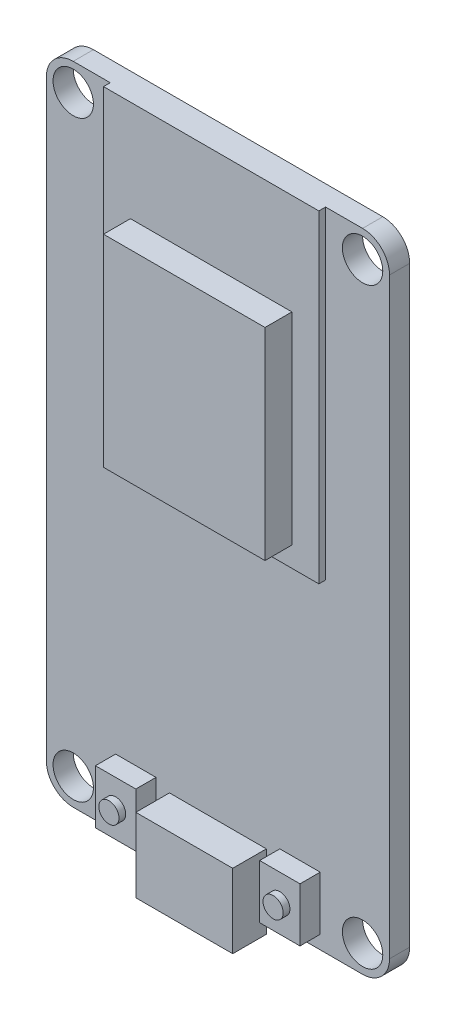
ISO-10303-21;
HEADER;
FILE_DESCRIPTION(('STEP AP214'),'2;1');
FILE_NAME('part.step','',(''),(''),'','','');
FILE_SCHEMA(('AUTOMOTIVE_DESIGN { 1 0 10303 214 1 1 1 1 }'));
ENDSEC;
DATA;
#1=APPLICATION_CONTEXT('core data for automotive mechanical design processes');
#2=APPLICATION_PROTOCOL_DEFINITION('international standard','automotive_design',2000,#1);
#3=PRODUCT_CONTEXT('',#1,'mechanical');
#4=PRODUCT('Part','Part','',(#3));
#5=PRODUCT_RELATED_PRODUCT_CATEGORY('part','',(#4));
#6=PRODUCT_DEFINITION_FORMATION('','',#4);
#7=PRODUCT_DEFINITION_CONTEXT('part definition',#1,'design');
#8=PRODUCT_DEFINITION('design','',#6,#7);
#9=PRODUCT_DEFINITION_SHAPE('','',#8);
#10=(LENGTH_UNIT() NAMED_UNIT(*) SI_UNIT(.MILLI.,.METRE.));
#11=(NAMED_UNIT(*) PLANE_ANGLE_UNIT() SI_UNIT($,.RADIAN.));
#12=(NAMED_UNIT(*) SI_UNIT($,.STERADIAN.) SOLID_ANGLE_UNIT());
#13=UNCERTAINTY_MEASURE_WITH_UNIT(LENGTH_MEASURE(1.E-05),#10,'distance_accuracy_value','');
#14=(GEOMETRIC_REPRESENTATION_CONTEXT(3) GLOBAL_UNCERTAINTY_ASSIGNED_CONTEXT((#13)) GLOBAL_UNIT_ASSIGNED_CONTEXT((#10,
#11,#12)) REPRESENTATION_CONTEXT('',''));
#15=CARTESIAN_POINT('',(0.,0.,0.));
#16=DIRECTION('',(0.,0.,1.));
#17=DIRECTION('',(1.,0.,0.));
#18=AXIS2_PLACEMENT_3D('',#15,#16,#17);
#19=CARTESIAN_POINT('',(0.,0.,1.5));
#20=DIRECTION('',(0.,0.,1.));
#21=DIRECTION('',(1.,0.,0.));
#22=AXIS2_PLACEMENT_3D('',#19,#20,#21);
#23=PLANE('',#22);
#24=CARTESIAN_POINT('',(-10.75,-22.,1.5));
#25=DIRECTION('',(0.,0.,1.));
#26=DIRECTION('',(1.,0.,0.));
#27=AXIS2_PLACEMENT_3D('',#24,#25,#26);
#28=CIRCLE('',#27,1.5);
#29=CARTESIAN_POINT('',(-9.25,-22.,1.5));
#30=VERTEX_POINT('',#29);
#31=EDGE_CURVE('E399',#30,#30,#28,.T.);
#32=ORIENTED_EDGE('',*,*,#31,.F.);
#33=EDGE_LOOP('',(#32));
#34=FACE_BOUND('',#33,.T.);
#35=CARTESIAN_POINT('',(10.75,-22.,1.5));
#36=DIRECTION('',(0.,0.,1.));
#37=DIRECTION('',(1.,0.,0.));
#38=AXIS2_PLACEMENT_3D('',#35,#36,#37);
#39=CIRCLE('',#38,1.5);
#40=CARTESIAN_POINT('',(12.25,-22.,1.5));
#41=VERTEX_POINT('',#40);
#42=EDGE_CURVE('E396',#41,#41,#39,.T.);
#43=ORIENTED_EDGE('',*,*,#42,.F.);
#44=EDGE_LOOP('',(#43));
#45=FACE_BOUND('',#44,.T.);
#46=CARTESIAN_POINT('',(10.75,22.,1.5));
#47=DIRECTION('',(0.,0.,1.));
#48=DIRECTION('',(1.,0.,0.));
#49=AXIS2_PLACEMENT_3D('',#46,#47,#48);
#50=CIRCLE('',#49,1.5);
#51=CARTESIAN_POINT('',(12.25,22.,1.5));
#52=VERTEX_POINT('',#51);
#53=EDGE_CURVE('E393',#52,#52,#50,.T.);
#54=ORIENTED_EDGE('',*,*,#53,.F.);
#55=EDGE_LOOP('',(#54));
#56=FACE_BOUND('',#55,.T.);
#57=CARTESIAN_POINT('',(-10.75,22.,1.5));
#58=DIRECTION('',(0.,0.,1.));
#59=DIRECTION('',(1.,0.,0.));
#60=AXIS2_PLACEMENT_3D('',#57,#58,#59);
#61=CIRCLE('',#60,1.5);
#62=CARTESIAN_POINT('',(-9.25000000000001,22.,1.5));
#63=VERTEX_POINT('',#62);
#64=EDGE_CURVE('E390',#63,#63,#61,.T.);
#65=ORIENTED_EDGE('',*,*,#64,.F.);
#66=EDGE_LOOP('',(#65));
#67=FACE_BOUND('',#66,.T.);
#68=DIRECTION('',(-1.,0.,0.));
#69=VECTOR('',#68,1.);
#70=CARTESIAN_POINT('',(-3.6,-19.5,1.5));
#71=LINE('',#70,#69);
#72=CARTESIAN_POINT('',(3.6,-19.5,1.5));
#73=VERTEX_POINT('',#72);
#74=CARTESIAN_POINT('',(-3.6,-19.5,1.5));
#75=VERTEX_POINT('',#74);
#76=EDGE_CURVE('E297',#73,#75,#71,.T.);
#77=ORIENTED_EDGE('',*,*,#76,.F.);
#78=DIRECTION('',(0.,-1.,0.));
#79=VECTOR('',#78,1.);
#80=CARTESIAN_POINT('',(3.6,0.,1.5));
#81=LINE('',#80,#79);
#82=CARTESIAN_POINT('',(3.6,-24.,1.5));
#83=VERTEX_POINT('',#82);
#84=EDGE_CURVE('E37',#73,#83,#81,.T.);
#85=ORIENTED_EDGE('',*,*,#84,.T.);
#86=DIRECTION('',(1.,0.,0.));
#87=VECTOR('',#86,1.);
#88=CARTESIAN_POINT('',(-12.75,-24.,1.5));
#89=LINE('',#88,#87);
#90=CARTESIAN_POINT('',(10.75,-24.,1.5));
#91=VERTEX_POINT('',#90);
#92=EDGE_CURVE('E413',#83,#91,#89,.T.);
#93=ORIENTED_EDGE('',*,*,#92,.T.);
#94=CARTESIAN_POINT('',(10.75,-22.,1.5));
#95=DIRECTION('',(0.,0.,1.));
#96=DIRECTION('',(1.,0.,0.));
#97=AXIS2_PLACEMENT_3D('',#94,#95,#96);
#98=CIRCLE('',#97,2.);
#99=CARTESIAN_POINT('',(12.75,-22.,1.5));
#100=VERTEX_POINT('',#99);
#101=EDGE_CURVE('E451',#91,#100,#98,.T.);
#102=ORIENTED_EDGE('',*,*,#101,.T.);
#103=DIRECTION('',(0.,1.,0.));
#104=VECTOR('',#103,1.);
#105=CARTESIAN_POINT('',(12.75,24.,1.5));
#106=LINE('',#105,#104);
#107=CARTESIAN_POINT('',(12.75,22.,1.5));
#108=VERTEX_POINT('',#107);
#109=EDGE_CURVE('E403',#100,#108,#106,.T.);
#110=ORIENTED_EDGE('',*,*,#109,.T.);
#111=CARTESIAN_POINT('',(10.75,22.,1.5));
#112=DIRECTION('',(0.,0.,1.));
#113=DIRECTION('',(1.,0.,0.));
#114=AXIS2_PLACEMENT_3D('',#111,#112,#113);
#115=CIRCLE('',#114,2.);
#116=CARTESIAN_POINT('',(10.75,24.,1.5));
#117=VERTEX_POINT('',#116);
#118=EDGE_CURVE('E447',#108,#117,#115,.T.);
#119=ORIENTED_EDGE('',*,*,#118,.T.);
#120=DIRECTION('',(-1.,0.,0.));
#121=VECTOR('',#120,1.);
#122=CARTESIAN_POINT('',(-12.75,24.,1.5));
#123=LINE('',#122,#121);
#124=CARTESIAN_POINT('',(7.99999999999999,24.,1.5));
#125=VERTEX_POINT('',#124);
#126=EDGE_CURVE('E408',#117,#125,#123,.T.);
#127=ORIENTED_EDGE('',*,*,#126,.T.);
#128=DIRECTION('',(0.,1.,0.));
#129=VECTOR('',#128,1.);
#130=CARTESIAN_POINT('',(7.99999999999999,24.,1.5));
#131=LINE('',#130,#129);
#132=CARTESIAN_POINT('',(8.,0.,1.5));
#133=VERTEX_POINT('',#132);
#134=EDGE_CURVE('E348',#133,#125,#131,.T.);
#135=ORIENTED_EDGE('',*,*,#134,.F.);
#136=DIRECTION('',(1.,0.,0.));
#137=VECTOR('',#136,1.);
#138=CARTESIAN_POINT('',(-8.,0.,1.5));
#139=LINE('',#138,#137);
#140=CARTESIAN_POINT('',(-8.,0.,1.5));
#141=VERTEX_POINT('',#140);
#142=EDGE_CURVE('E353',#141,#133,#139,.T.);
#143=ORIENTED_EDGE('',*,*,#142,.F.);
#144=DIRECTION('',(0.,-1.,0.));
#145=VECTOR('',#144,1.);
#146=CARTESIAN_POINT('',(-8.00000000000001,24.,1.5));
#147=LINE('',#146,#145);
#148=CARTESIAN_POINT('',(-8.00000000000001,24.,1.5));
#149=VERTEX_POINT('',#148);
#150=EDGE_CURVE('E362',#149,#141,#147,.T.);
#151=ORIENTED_EDGE('',*,*,#150,.F.);
#152=CARTESIAN_POINT('',(-10.75,24.,1.5));
#153=VERTEX_POINT('',#152);
#154=EDGE_CURVE('E406',#149,#153,#123,.T.);
#155=ORIENTED_EDGE('',*,*,#154,.T.);
#156=CARTESIAN_POINT('',(-10.75,22.,1.5));
#157=DIRECTION('',(0.,0.,1.));
#158=DIRECTION('',(1.,0.,0.));
#159=AXIS2_PLACEMENT_3D('',#156,#157,#158);
#160=CIRCLE('',#159,2.);
#161=CARTESIAN_POINT('',(-12.75,22.,1.5));
#162=VERTEX_POINT('',#161);
#163=EDGE_CURVE('E449',#153,#162,#160,.T.);
#164=ORIENTED_EDGE('',*,*,#163,.T.);
#165=DIRECTION('',(0.,-1.,0.));
#166=VECTOR('',#165,1.);
#167=CARTESIAN_POINT('',(-12.75,24.,1.5));
#168=LINE('',#167,#166);
#169=CARTESIAN_POINT('',(-12.75,-22.,1.5));
#170=VERTEX_POINT('',#169);
#171=EDGE_CURVE('E410',#162,#170,#168,.T.);
#172=ORIENTED_EDGE('',*,*,#171,.T.);
#173=CARTESIAN_POINT('',(-10.75,-22.,1.5));
#174=DIRECTION('',(0.,0.,1.));
#175=DIRECTION('',(1.,0.,0.));
#176=AXIS2_PLACEMENT_3D('',#173,#174,#175);
#177=CIRCLE('',#176,2.);
#178=CARTESIAN_POINT('',(-10.75,-24.,1.5));
#179=VERTEX_POINT('',#178);
#180=EDGE_CURVE('E453',#170,#179,#177,.T.);
#181=ORIENTED_EDGE('',*,*,#180,.T.);
#182=CARTESIAN_POINT('',(-3.6,-24.,1.5));
#183=VERTEX_POINT('',#182);
#184=EDGE_CURVE('E414',#179,#183,#89,.T.);
#185=ORIENTED_EDGE('',*,*,#184,.T.);
#186=DIRECTION('',(0.,-1.,0.));
#187=VECTOR('',#186,1.);
#188=CARTESIAN_POINT('',(-3.6,-19.5,1.5));
#189=LINE('',#188,#187);
#190=EDGE_CURVE('E301',#75,#183,#189,.T.);
#191=ORIENTED_EDGE('',*,*,#190,.F.);
#192=EDGE_LOOP('',(#77,#85,#93,#102,#110,#119,#127,#135,#143,#151,#155,#164,#172,#181,#185,#191));
#193=FACE_BOUND('',#192,.T.);
#194=DIRECTION('',(1.,0.,0.));
#195=VECTOR('',#194,1.);
#196=CARTESIAN_POINT('',(-7.6,-23.,1.5));
#197=LINE('',#196,#195);
#198=CARTESIAN_POINT('',(-7.6,-23.,1.5));
#199=VERTEX_POINT('',#198);
#200=CARTESIAN_POINT('',(-4.59999999999999,-23.,1.5));
#201=VERTEX_POINT('',#200);
#202=EDGE_CURVE('E255',#199,#201,#197,.T.);
#203=ORIENTED_EDGE('',*,*,#202,.F.);
#204=DIRECTION('',(0.,-1.,0.));
#205=VECTOR('',#204,1.);
#206=CARTESIAN_POINT('',(-7.6,-19.,1.5));
#207=LINE('',#206,#205);
#208=CARTESIAN_POINT('',(-7.6,-19.,1.5));
#209=VERTEX_POINT('',#208);
#210=EDGE_CURVE('E252',#209,#199,#207,.T.);
#211=ORIENTED_EDGE('',*,*,#210,.F.);
#212=DIRECTION('',(-1.,0.,0.));
#213=VECTOR('',#212,1.);
#214=CARTESIAN_POINT('',(-7.6,-19.,1.5));
#215=LINE('',#214,#213);
#216=CARTESIAN_POINT('',(-4.6,-19.,1.5));
#217=VERTEX_POINT('',#216);
#218=EDGE_CURVE('E264',#217,#209,#215,.T.);
#219=ORIENTED_EDGE('',*,*,#218,.F.);
#220=DIRECTION('',(0.,1.,0.));
#221=VECTOR('',#220,1.);
#222=CARTESIAN_POINT('',(-4.6,-19.,1.5));
#223=LINE('',#222,#221);
#224=EDGE_CURVE('E272',#201,#217,#223,.T.);
#225=ORIENTED_EDGE('',*,*,#224,.F.);
#226=EDGE_LOOP('',(#203,#211,#219,#225));
#227=FACE_BOUND('',#226,.T.);
#228=DIRECTION('',(-1.,0.,0.));
#229=VECTOR('',#228,1.);
#230=CARTESIAN_POINT('',(7.6,-19.,1.5));
#231=LINE('',#230,#229);
#232=CARTESIAN_POINT('',(7.6,-19.,1.5));
#233=VERTEX_POINT('',#232);
#234=CARTESIAN_POINT('',(4.6,-19.,1.5));
#235=VERTEX_POINT('',#234);
#236=EDGE_CURVE('E483',#233,#235,#231,.T.);
#237=ORIENTED_EDGE('',*,*,#236,.F.);
#238=DIRECTION('',(0.,1.,0.));
#239=VECTOR('',#238,1.);
#240=CARTESIAN_POINT('',(7.6,-19.,1.5));
#241=LINE('',#240,#239);
#242=CARTESIAN_POINT('',(7.6,-23.,1.5));
#243=VERTEX_POINT('',#242);
#244=EDGE_CURVE('E250',#243,#233,#241,.T.);
#245=ORIENTED_EDGE('',*,*,#244,.F.);
#246=DIRECTION('',(1.,0.,0.));
#247=VECTOR('',#246,1.);
#248=CARTESIAN_POINT('',(7.6,-23.,1.5));
#249=LINE('',#248,#247);
#250=CARTESIAN_POINT('',(4.59999999999999,-23.,1.5));
#251=VERTEX_POINT('',#250);
#252=EDGE_CURVE('E246',#251,#243,#249,.T.);
#253=ORIENTED_EDGE('',*,*,#252,.F.);
#254=DIRECTION('',(0.,-1.,0.));
#255=VECTOR('',#254,1.);
#256=CARTESIAN_POINT('',(4.6,-19.,1.5));
#257=LINE('',#256,#255);
#258=EDGE_CURVE('E485',#235,#251,#257,.T.);
#259=ORIENTED_EDGE('',*,*,#258,.F.);
#260=EDGE_LOOP('',(#237,#245,#253,#259));
#261=FACE_BOUND('',#260,.T.);
#262=ADVANCED_FACE('F33',(#34,#45,#56,#67,#193,#227,#261),#23,.T.);
#263=CARTESIAN_POINT('',(12.75,24.,1.5));
#264=DIRECTION('',(-1.,0.,0.));
#265=DIRECTION('',(0.,-1.,0.));
#266=AXIS2_PLACEMENT_3D('',#263,#264,#265);
#267=PLANE('',#266);
#268=ORIENTED_EDGE('',*,*,#109,.F.);
#269=DIRECTION('',(0.,0.,-1.));
#270=VECTOR('',#269,1.);
#271=CARTESIAN_POINT('',(12.75,-22.,1.5));
#272=LINE('',#271,#270);
#273=CARTESIAN_POINT('',(12.75,-22.,0.));
#274=VERTEX_POINT('',#273);
#275=EDGE_CURVE('E457',#100,#274,#272,.T.);
#276=ORIENTED_EDGE('',*,*,#275,.T.);
#277=DIRECTION('',(0.,1.,0.));
#278=VECTOR('',#277,1.);
#279=CARTESIAN_POINT('',(12.75,24.,0.));
#280=LINE('',#279,#278);
#281=CARTESIAN_POINT('',(12.75,22.,0.));
#282=VERTEX_POINT('',#281);
#283=EDGE_CURVE('E402',#274,#282,#280,.T.);
#284=ORIENTED_EDGE('',*,*,#283,.T.);
#285=DIRECTION('',(0.,0.,-1.));
#286=VECTOR('',#285,1.);
#287=CARTESIAN_POINT('',(12.75,22.,1.5));
#288=LINE('',#287,#286);
#289=EDGE_CURVE('E455',#282,#108,#288,.F.);
#290=ORIENTED_EDGE('',*,*,#289,.T.);
#291=EDGE_LOOP('',(#268,#276,#284,#290));
#292=FACE_BOUND('',#291,.T.);
#293=ADVANCED_FACE('F505',(#292),#267,.F.);
#294=CARTESIAN_POINT('',(-12.75,24.,1.5));
#295=DIRECTION('',(0.,-1.,0.));
#296=DIRECTION('',(0.,0.,-1.));
#297=AXIS2_PLACEMENT_3D('',#294,#295,#296);
#298=PLANE('',#297);
#299=DIRECTION('',(-1.,0.,0.));
#300=VECTOR('',#299,1.);
#301=CARTESIAN_POINT('',(-12.75,24.,0.));
#302=LINE('',#301,#300);
#303=CARTESIAN_POINT('',(10.75,24.,0.));
#304=VERTEX_POINT('',#303);
#305=CARTESIAN_POINT('',(-10.75,24.,0.));
#306=VERTEX_POINT('',#305);
#307=EDGE_CURVE('E421',#304,#306,#302,.T.);
#308=ORIENTED_EDGE('',*,*,#307,.T.);
#309=DIRECTION('',(0.,0.,-1.));
#310=VECTOR('',#309,1.);
#311=CARTESIAN_POINT('',(-10.75,24.,1.5));
#312=LINE('',#311,#310);
#313=EDGE_CURVE('E462',#306,#153,#312,.F.);
#314=ORIENTED_EDGE('',*,*,#313,.T.);
#315=ORIENTED_EDGE('',*,*,#154,.F.);
#316=DIRECTION('',(0.,0.,-1.));
#317=VECTOR('',#316,1.);
#318=CARTESIAN_POINT('',(-8.00000000000001,24.,2.));
#319=LINE('',#318,#317);
#320=CARTESIAN_POINT('',(-8.00000000000001,24.,2.));
#321=VERTEX_POINT('',#320);
#322=EDGE_CURVE('E372',#321,#149,#319,.T.);
#323=ORIENTED_EDGE('',*,*,#322,.F.);
#324=DIRECTION('',(-1.,0.,0.));
#325=VECTOR('',#324,1.);
#326=CARTESIAN_POINT('',(-8.00000000000001,24.,2.));
#327=LINE('',#326,#325);
#328=CARTESIAN_POINT('',(7.99999999999999,24.,2.));
#329=VERTEX_POINT('',#328);
#330=EDGE_CURVE('E352',#329,#321,#327,.T.);
#331=ORIENTED_EDGE('',*,*,#330,.F.);
#332=DIRECTION('',(0.,0.,-1.));
#333=VECTOR('',#332,1.);
#334=CARTESIAN_POINT('',(7.99999999999999,24.,2.));
#335=LINE('',#334,#333);
#336=EDGE_CURVE('E375',#329,#125,#335,.T.);
#337=ORIENTED_EDGE('',*,*,#336,.T.);
#338=ORIENTED_EDGE('',*,*,#126,.F.);
#339=DIRECTION('',(0.,0.,-1.));
#340=VECTOR('',#339,1.);
#341=CARTESIAN_POINT('',(10.75,24.,1.5));
#342=LINE('',#341,#340);
#343=EDGE_CURVE('E460',#117,#304,#342,.T.);
#344=ORIENTED_EDGE('',*,*,#343,.T.);
#345=EDGE_LOOP('',(#308,#314,#315,#323,#331,#337,#338,#344));
#346=FACE_BOUND('',#345,.T.);
#347=ADVANCED_FACE('F513',(#346),#298,.F.);
#348=CARTESIAN_POINT('',(-12.75,24.,1.5));
#349=DIRECTION('',(1.,0.,0.));
#350=DIRECTION('',(0.,1.,0.));
#351=AXIS2_PLACEMENT_3D('',#348,#349,#350);
#352=PLANE('',#351);
#353=DIRECTION('',(0.,-1.,0.));
#354=VECTOR('',#353,1.);
#355=CARTESIAN_POINT('',(-12.75,24.,0.));
#356=LINE('',#355,#354);
#357=CARTESIAN_POINT('',(-12.75,22.,0.));
#358=VERTEX_POINT('',#357);
#359=CARTESIAN_POINT('',(-12.75,-22.,0.));
#360=VERTEX_POINT('',#359);
#361=EDGE_CURVE('E424',#358,#360,#356,.T.);
#362=ORIENTED_EDGE('',*,*,#361,.T.);
#363=DIRECTION('',(0.,0.,-1.));
#364=VECTOR('',#363,1.);
#365=CARTESIAN_POINT('',(-12.75,-22.,1.5));
#366=LINE('',#365,#364);
#367=EDGE_CURVE('E445',#360,#170,#366,.F.);
#368=ORIENTED_EDGE('',*,*,#367,.T.);
#369=ORIENTED_EDGE('',*,*,#171,.F.);
#370=DIRECTION('',(0.,0.,-1.));
#371=VECTOR('',#370,1.);
#372=CARTESIAN_POINT('',(-12.75,22.,1.5));
#373=LINE('',#372,#371);
#374=EDGE_CURVE('E442',#162,#358,#373,.T.);
#375=ORIENTED_EDGE('',*,*,#374,.T.);
#376=EDGE_LOOP('',(#362,#368,#369,#375));
#377=FACE_BOUND('',#376,.T.);
#378=ADVANCED_FACE('F530',(#377),#352,.F.);
#379=CARTESIAN_POINT('',(-12.75,-24.,1.5));
#380=DIRECTION('',(0.,1.,0.));
#381=DIRECTION('',(0.,0.,1.));
#382=AXIS2_PLACEMENT_3D('',#379,#380,#381);
#383=PLANE('',#382);
#384=ORIENTED_EDGE('',*,*,#184,.F.);
#385=DIRECTION('',(0.,0.,-1.));
#386=VECTOR('',#385,1.);
#387=CARTESIAN_POINT('',(-10.75,-24.,1.5));
#388=LINE('',#387,#386);
#389=CARTESIAN_POINT('',(-10.75,-24.,0.));
#390=VERTEX_POINT('',#389);
#391=EDGE_CURVE('E431',#179,#390,#388,.T.);
#392=ORIENTED_EDGE('',*,*,#391,.T.);
#393=DIRECTION('',(1.,0.,0.));
#394=VECTOR('',#393,1.);
#395=CARTESIAN_POINT('',(-12.75,-24.,0.));
#396=LINE('',#395,#394);
#397=CARTESIAN_POINT('',(10.75,-24.,0.));
#398=VERTEX_POINT('',#397);
#399=EDGE_CURVE('E407',#390,#398,#396,.T.);
#400=ORIENTED_EDGE('',*,*,#399,.T.);
#401=DIRECTION('',(0.,0.,-1.));
#402=VECTOR('',#401,1.);
#403=CARTESIAN_POINT('',(10.75,-24.,1.5));
#404=LINE('',#403,#402);
#405=EDGE_CURVE('E417',#398,#91,#404,.F.);
#406=ORIENTED_EDGE('',*,*,#405,.T.);
#407=ORIENTED_EDGE('',*,*,#92,.F.);
#408=EDGE_CURVE('E418',#183,#83,#89,.T.);
#409=ORIENTED_EDGE('',*,*,#408,.F.);
#410=EDGE_LOOP('',(#384,#392,#400,#406,#407,#409));
#411=FACE_BOUND('',#410,.T.);
#412=ADVANCED_FACE('F526',(#411),#383,.F.);
#413=CARTESIAN_POINT('',(0.,0.,0.));
#414=DIRECTION('',(0.,0.,1.));
#415=DIRECTION('',(1.,0.,0.));
#416=AXIS2_PLACEMENT_3D('',#413,#414,#415);
#417=PLANE('',#416);
#418=CARTESIAN_POINT('',(-10.75,-22.,0.));
#419=DIRECTION('',(0.,0.,1.));
#420=DIRECTION('',(1.,0.,0.));
#421=AXIS2_PLACEMENT_3D('',#418,#419,#420);
#422=CIRCLE('',#421,1.5);
#423=CARTESIAN_POINT('',(-9.25,-22.,0.));
#424=VERTEX_POINT('',#423);
#425=EDGE_CURVE('E378',#424,#424,#422,.T.);
#426=ORIENTED_EDGE('',*,*,#425,.T.);
#427=EDGE_LOOP('',(#426));
#428=FACE_BOUND('',#427,.T.);
#429=CARTESIAN_POINT('',(10.75,-22.,0.));
#430=DIRECTION('',(0.,0.,1.));
#431=DIRECTION('',(1.,0.,0.));
#432=AXIS2_PLACEMENT_3D('',#429,#430,#431);
#433=CIRCLE('',#432,1.5);
#434=CARTESIAN_POINT('',(12.25,-22.,0.));
#435=VERTEX_POINT('',#434);
#436=EDGE_CURVE('E383',#435,#435,#433,.T.);
#437=ORIENTED_EDGE('',*,*,#436,.T.);
#438=EDGE_LOOP('',(#437));
#439=FACE_BOUND('',#438,.T.);
#440=CARTESIAN_POINT('',(10.75,22.,0.));
#441=DIRECTION('',(0.,0.,1.));
#442=DIRECTION('',(1.,0.,0.));
#443=AXIS2_PLACEMENT_3D('',#440,#441,#442);
#444=CIRCLE('',#443,1.5);
#445=CARTESIAN_POINT('',(12.25,22.,0.));
#446=VERTEX_POINT('',#445);
#447=EDGE_CURVE('E379',#446,#446,#444,.T.);
#448=ORIENTED_EDGE('',*,*,#447,.T.);
#449=EDGE_LOOP('',(#448));
#450=FACE_BOUND('',#449,.T.);
#451=CARTESIAN_POINT('',(-10.75,22.,0.));
#452=DIRECTION('',(0.,0.,1.));
#453=DIRECTION('',(1.,0.,0.));
#454=AXIS2_PLACEMENT_3D('',#451,#452,#453);
#455=CIRCLE('',#454,1.5);
#456=CARTESIAN_POINT('',(-9.25000000000001,22.,0.));
#457=VERTEX_POINT('',#456);
#458=EDGE_CURVE('E382',#457,#457,#455,.T.);
#459=ORIENTED_EDGE('',*,*,#458,.T.);
#460=EDGE_LOOP('',(#459));
#461=FACE_BOUND('',#460,.T.);
#462=ORIENTED_EDGE('',*,*,#399,.F.);
#463=CARTESIAN_POINT('',(-10.75,-22.,0.));
#464=DIRECTION('',(0.,0.,1.));
#465=DIRECTION('',(1.,0.,0.));
#466=AXIS2_PLACEMENT_3D('',#463,#464,#465);
#467=CIRCLE('',#466,2.);
#468=EDGE_CURVE('E440',#390,#360,#467,.F.);
#469=ORIENTED_EDGE('',*,*,#468,.T.);
#470=ORIENTED_EDGE('',*,*,#361,.F.);
#471=CARTESIAN_POINT('',(-10.75,22.,0.));
#472=DIRECTION('',(0.,0.,1.));
#473=DIRECTION('',(1.,0.,0.));
#474=AXIS2_PLACEMENT_3D('',#471,#472,#473);
#475=CIRCLE('',#474,2.);
#476=EDGE_CURVE('E436',#358,#306,#475,.F.);
#477=ORIENTED_EDGE('',*,*,#476,.T.);
#478=ORIENTED_EDGE('',*,*,#307,.F.);
#479=CARTESIAN_POINT('',(10.75,22.,0.));
#480=DIRECTION('',(0.,0.,1.));
#481=DIRECTION('',(1.,0.,0.));
#482=AXIS2_PLACEMENT_3D('',#479,#480,#481);
#483=CIRCLE('',#482,2.);
#484=EDGE_CURVE('E434',#304,#282,#483,.F.);
#485=ORIENTED_EDGE('',*,*,#484,.T.);
#486=ORIENTED_EDGE('',*,*,#283,.F.);
#487=CARTESIAN_POINT('',(10.75,-22.,0.));
#488=DIRECTION('',(0.,0.,1.));
#489=DIRECTION('',(1.,0.,0.));
#490=AXIS2_PLACEMENT_3D('',#487,#488,#489);
#491=CIRCLE('',#490,2.);
#492=EDGE_CURVE('E438',#274,#398,#491,.F.);
#493=ORIENTED_EDGE('',*,*,#492,.T.);
#494=EDGE_LOOP('',(#462,#469,#470,#477,#478,#485,#486,#493));
#495=FACE_BOUND('',#494,.T.);
#496=ADVANCED_FACE('F522',(#428,#439,#450,#461,#495),#417,.F.);
#497=CARTESIAN_POINT('',(-10.75,-22.,1.5));
#498=DIRECTION('',(0.,0.,-1.));
#499=DIRECTION('',(-1.,0.,0.));
#500=AXIS2_PLACEMENT_3D('',#497,#498,#499);
#501=CYLINDRICAL_SURFACE('',#500,2.);
#502=ORIENTED_EDGE('',*,*,#180,.F.);
#503=ORIENTED_EDGE('',*,*,#367,.F.);
#504=ORIENTED_EDGE('',*,*,#468,.F.);
#505=ORIENTED_EDGE('',*,*,#391,.F.);
#506=EDGE_LOOP('',(#502,#503,#504,#505));
#507=FACE_BOUND('',#506,.T.);
#508=ADVANCED_FACE('F525',(#507),#501,.T.);
#509=CARTESIAN_POINT('',(10.75,-22.,1.5));
#510=DIRECTION('',(0.,0.,-1.));
#511=DIRECTION('',(-1.,0.,0.));
#512=AXIS2_PLACEMENT_3D('',#509,#510,#511);
#513=CYLINDRICAL_SURFACE('',#512,2.);
#514=ORIENTED_EDGE('',*,*,#101,.F.);
#515=ORIENTED_EDGE('',*,*,#405,.F.);
#516=ORIENTED_EDGE('',*,*,#492,.F.);
#517=ORIENTED_EDGE('',*,*,#275,.F.);
#518=EDGE_LOOP('',(#514,#515,#516,#517));
#519=FACE_BOUND('',#518,.T.);
#520=ADVANCED_FACE('F539',(#519),#513,.T.);
#521=CARTESIAN_POINT('',(-10.75,22.,1.5));
#522=DIRECTION('',(0.,0.,-1.));
#523=DIRECTION('',(-1.,0.,0.));
#524=AXIS2_PLACEMENT_3D('',#521,#522,#523);
#525=CYLINDRICAL_SURFACE('',#524,2.);
#526=ORIENTED_EDGE('',*,*,#163,.F.);
#527=ORIENTED_EDGE('',*,*,#313,.F.);
#528=ORIENTED_EDGE('',*,*,#476,.F.);
#529=ORIENTED_EDGE('',*,*,#374,.F.);
#530=EDGE_LOOP('',(#526,#527,#528,#529));
#531=FACE_BOUND('',#530,.T.);
#532=ADVANCED_FACE('F542',(#531),#525,.T.);
#533=CARTESIAN_POINT('',(10.75,22.,1.5));
#534=DIRECTION('',(0.,0.,-1.));
#535=DIRECTION('',(-1.,0.,0.));
#536=AXIS2_PLACEMENT_3D('',#533,#534,#535);
#537=CYLINDRICAL_SURFACE('',#536,2.);
#538=ORIENTED_EDGE('',*,*,#118,.F.);
#539=ORIENTED_EDGE('',*,*,#289,.F.);
#540=ORIENTED_EDGE('',*,*,#484,.F.);
#541=ORIENTED_EDGE('',*,*,#343,.F.);
#542=EDGE_LOOP('',(#538,#539,#540,#541));
#543=FACE_BOUND('',#542,.T.);
#544=ADVANCED_FACE('F35',(#543),#537,.T.);
#545=CARTESIAN_POINT('',(-10.75,22.,0.));
#546=DIRECTION('',(0.,0.,1.));
#547=DIRECTION('',(1.,0.,0.));
#548=AXIS2_PLACEMENT_3D('',#545,#546,#547);
#549=CYLINDRICAL_SURFACE('',#548,1.5);
#550=ORIENTED_EDGE('',*,*,#64,.T.);
#551=EDGE_LOOP('',(#550));
#552=FACE_BOUND('',#551,.T.);
#553=ORIENTED_EDGE('',*,*,#458,.F.);
#554=EDGE_LOOP('',(#553));
#555=FACE_BOUND('',#554,.T.);
#556=ADVANCED_FACE('F520',(#552,#555),#549,.F.);
#557=CARTESIAN_POINT('',(10.75,22.,0.));
#558=DIRECTION('',(0.,0.,1.));
#559=DIRECTION('',(1.,0.,0.));
#560=AXIS2_PLACEMENT_3D('',#557,#558,#559);
#561=CYLINDRICAL_SURFACE('',#560,1.5);
#562=ORIENTED_EDGE('',*,*,#53,.T.);
#563=EDGE_LOOP('',(#562));
#564=FACE_BOUND('',#563,.T.);
#565=ORIENTED_EDGE('',*,*,#447,.F.);
#566=EDGE_LOOP('',(#565));
#567=FACE_BOUND('',#566,.T.);
#568=ADVANCED_FACE('F600',(#564,#567),#561,.F.);
#569=CARTESIAN_POINT('',(10.75,-22.,0.));
#570=DIRECTION('',(0.,0.,1.));
#571=DIRECTION('',(1.,0.,0.));
#572=AXIS2_PLACEMENT_3D('',#569,#570,#571);
#573=CYLINDRICAL_SURFACE('',#572,1.5);
#574=ORIENTED_EDGE('',*,*,#42,.T.);
#575=EDGE_LOOP('',(#574));
#576=FACE_BOUND('',#575,.T.);
#577=ORIENTED_EDGE('',*,*,#436,.F.);
#578=EDGE_LOOP('',(#577));
#579=FACE_BOUND('',#578,.T.);
#580=ADVANCED_FACE('F603',(#576,#579),#573,.F.);
#581=CARTESIAN_POINT('',(-10.75,-22.,0.));
#582=DIRECTION('',(0.,0.,1.));
#583=DIRECTION('',(1.,0.,0.));
#584=AXIS2_PLACEMENT_3D('',#581,#582,#583);
#585=CYLINDRICAL_SURFACE('',#584,1.5);
#586=ORIENTED_EDGE('',*,*,#31,.T.);
#587=EDGE_LOOP('',(#586));
#588=FACE_BOUND('',#587,.T.);
#589=ORIENTED_EDGE('',*,*,#425,.F.);
#590=EDGE_LOOP('',(#589));
#591=FACE_BOUND('',#590,.T.);
#592=ADVANCED_FACE('F596',(#588,#591),#585,.F.);
#593=CARTESIAN_POINT('',(7.99999999999999,24.,2.));
#594=DIRECTION('',(-1.,0.,0.));
#595=DIRECTION('',(0.,-1.,0.));
#596=AXIS2_PLACEMENT_3D('',#593,#594,#595);
#597=PLANE('',#596);
#598=ORIENTED_EDGE('',*,*,#134,.T.);
#599=ORIENTED_EDGE('',*,*,#336,.F.);
#600=DIRECTION('',(0.,1.,0.));
#601=VECTOR('',#600,1.);
#602=CARTESIAN_POINT('',(7.99999999999999,24.,2.));
#603=LINE('',#602,#601);
#604=CARTESIAN_POINT('',(8.,0.,2.));
#605=VERTEX_POINT('',#604);
#606=EDGE_CURVE('E349',#605,#329,#603,.T.);
#607=ORIENTED_EDGE('',*,*,#606,.F.);
#608=DIRECTION('',(0.,0.,-1.));
#609=VECTOR('',#608,1.);
#610=CARTESIAN_POINT('',(8.,0.,2.));
#611=LINE('',#610,#609);
#612=EDGE_CURVE('E359',#605,#133,#611,.T.);
#613=ORIENTED_EDGE('',*,*,#612,.T.);
#614=EDGE_LOOP('',(#598,#599,#607,#613));
#615=FACE_BOUND('',#614,.T.);
#616=ADVANCED_FACE('F582',(#615),#597,.F.);
#617=CARTESIAN_POINT('',(-8.00000000000001,24.,2.));
#618=DIRECTION('',(1.,0.,0.));
#619=DIRECTION('',(0.,1.,0.));
#620=AXIS2_PLACEMENT_3D('',#617,#618,#619);
#621=PLANE('',#620);
#622=ORIENTED_EDGE('',*,*,#150,.T.);
#623=DIRECTION('',(0.,0.,-1.));
#624=VECTOR('',#623,1.);
#625=CARTESIAN_POINT('',(-8.,0.,2.));
#626=LINE('',#625,#624);
#627=CARTESIAN_POINT('',(-8.,0.,2.));
#628=VERTEX_POINT('',#627);
#629=EDGE_CURVE('E369',#628,#141,#626,.T.);
#630=ORIENTED_EDGE('',*,*,#629,.F.);
#631=DIRECTION('',(0.,-1.,0.));
#632=VECTOR('',#631,1.);
#633=CARTESIAN_POINT('',(-8.00000000000001,24.,2.));
#634=LINE('',#633,#632);
#635=EDGE_CURVE('E355',#321,#628,#634,.T.);
#636=ORIENTED_EDGE('',*,*,#635,.F.);
#637=ORIENTED_EDGE('',*,*,#322,.T.);
#638=EDGE_LOOP('',(#622,#630,#636,#637));
#639=FACE_BOUND('',#638,.T.);
#640=ADVANCED_FACE('F588',(#639),#621,.F.);
#641=CARTESIAN_POINT('',(-8.,0.,2.));
#642=DIRECTION('',(0.,1.,0.));
#643=DIRECTION('',(-1.,0.,0.));
#644=AXIS2_PLACEMENT_3D('',#641,#642,#643);
#645=PLANE('',#644);
#646=ORIENTED_EDGE('',*,*,#142,.T.);
#647=ORIENTED_EDGE('',*,*,#612,.F.);
#648=DIRECTION('',(1.,0.,0.));
#649=VECTOR('',#648,1.);
#650=CARTESIAN_POINT('',(-8.,0.,2.));
#651=LINE('',#650,#649);
#652=EDGE_CURVE('E357',#628,#605,#651,.T.);
#653=ORIENTED_EDGE('',*,*,#652,.F.);
#654=ORIENTED_EDGE('',*,*,#629,.T.);
#655=EDGE_LOOP('',(#646,#647,#653,#654));
#656=FACE_BOUND('',#655,.T.);
#657=ADVANCED_FACE('F578',(#656),#645,.F.);
#658=CARTESIAN_POINT('',(0.,0.,2.));
#659=DIRECTION('',(0.,0.,1.));
#660=DIRECTION('',(1.,0.,0.));
#661=AXIS2_PLACEMENT_3D('',#658,#659,#660);
#662=PLANE('',#661);
#663=DIRECTION('',(0.,1.,0.));
#664=VECTOR('',#663,1.);
#665=CARTESIAN_POINT('',(6.,16.5,2.));
#666=LINE('',#665,#664);
#667=CARTESIAN_POINT('',(6.,1.49999999999999,2.));
#668=VERTEX_POINT('',#667);
#669=CARTESIAN_POINT('',(6.,16.5,2.));
#670=VERTEX_POINT('',#669);
#671=EDGE_CURVE('E315',#668,#670,#666,.T.);
#672=ORIENTED_EDGE('',*,*,#671,.F.);
#673=DIRECTION('',(1.,0.,0.));
#674=VECTOR('',#673,1.);
#675=CARTESIAN_POINT('',(-6.,1.49999999999999,2.));
#676=LINE('',#675,#674);
#677=CARTESIAN_POINT('',(-6.,1.49999999999999,2.));
#678=VERTEX_POINT('',#677);
#679=EDGE_CURVE('E320',#678,#668,#676,.T.);
#680=ORIENTED_EDGE('',*,*,#679,.F.);
#681=DIRECTION('',(0.,-1.,0.));
#682=VECTOR('',#681,1.);
#683=CARTESIAN_POINT('',(-6.,16.5,2.));
#684=LINE('',#683,#682);
#685=CARTESIAN_POINT('',(-6.,16.5,2.));
#686=VERTEX_POINT('',#685);
#687=EDGE_CURVE('E332',#686,#678,#684,.T.);
#688=ORIENTED_EDGE('',*,*,#687,.F.);
#689=DIRECTION('',(-1.,0.,0.));
#690=VECTOR('',#689,1.);
#691=CARTESIAN_POINT('',(-6.,16.5,2.));
#692=LINE('',#691,#690);
#693=EDGE_CURVE('E329',#670,#686,#692,.T.);
#694=ORIENTED_EDGE('',*,*,#693,.F.);
#695=EDGE_LOOP('',(#672,#680,#688,#694));
#696=FACE_BOUND('',#695,.T.);
#697=ORIENTED_EDGE('',*,*,#606,.T.);
#698=ORIENTED_EDGE('',*,*,#330,.T.);
#699=ORIENTED_EDGE('',*,*,#635,.T.);
#700=ORIENTED_EDGE('',*,*,#652,.T.);
#701=EDGE_LOOP('',(#697,#698,#699,#700));
#702=FACE_BOUND('',#701,.T.);
#703=ADVANCED_FACE('F584',(#696,#702),#662,.T.);
#704=CARTESIAN_POINT('',(6.,16.5,4.));
#705=DIRECTION('',(-1.,0.,0.));
#706=DIRECTION('',(0.,-1.,0.));
#707=AXIS2_PLACEMENT_3D('',#704,#705,#706);
#708=PLANE('',#707);
#709=ORIENTED_EDGE('',*,*,#671,.T.);
#710=DIRECTION('',(0.,0.,-1.));
#711=VECTOR('',#710,1.);
#712=CARTESIAN_POINT('',(6.,16.5,4.));
#713=LINE('',#712,#711);
#714=CARTESIAN_POINT('',(6.,16.5,4.));
#715=VERTEX_POINT('',#714);
#716=EDGE_CURVE('E345',#715,#670,#713,.T.);
#717=ORIENTED_EDGE('',*,*,#716,.F.);
#718=DIRECTION('',(0.,1.,0.));
#719=VECTOR('',#718,1.);
#720=CARTESIAN_POINT('',(6.,16.5,4.));
#721=LINE('',#720,#719);
#722=CARTESIAN_POINT('',(6.,1.49999999999999,4.));
#723=VERTEX_POINT('',#722);
#724=EDGE_CURVE('E316',#723,#715,#721,.T.);
#725=ORIENTED_EDGE('',*,*,#724,.F.);
#726=DIRECTION('',(0.,0.,-1.));
#727=VECTOR('',#726,1.);
#728=CARTESIAN_POINT('',(6.,1.49999999999999,4.));
#729=LINE('',#728,#727);
#730=EDGE_CURVE('E326',#723,#668,#729,.T.);
#731=ORIENTED_EDGE('',*,*,#730,.T.);
#732=EDGE_LOOP('',(#709,#717,#725,#731));
#733=FACE_BOUND('',#732,.T.);
#734=ADVANCED_FACE('F674',(#733),#708,.F.);
#735=CARTESIAN_POINT('',(-6.,16.5,4.));
#736=DIRECTION('',(0.,-1.,0.));
#737=DIRECTION('',(0.,0.,-1.));
#738=AXIS2_PLACEMENT_3D('',#735,#736,#737);
#739=PLANE('',#738);
#740=ORIENTED_EDGE('',*,*,#693,.T.);
#741=DIRECTION('',(0.,0.,-1.));
#742=VECTOR('',#741,1.);
#743=CARTESIAN_POINT('',(-6.,16.5,4.));
#744=LINE('',#743,#742);
#745=CARTESIAN_POINT('',(-6.,16.5,4.));
#746=VERTEX_POINT('',#745);
#747=EDGE_CURVE('E342',#746,#686,#744,.T.);
#748=ORIENTED_EDGE('',*,*,#747,.F.);
#749=DIRECTION('',(-1.,0.,0.));
#750=VECTOR('',#749,1.);
#751=CARTESIAN_POINT('',(-6.,16.5,4.));
#752=LINE('',#751,#750);
#753=EDGE_CURVE('E319',#715,#746,#752,.T.);
#754=ORIENTED_EDGE('',*,*,#753,.F.);
#755=ORIENTED_EDGE('',*,*,#716,.T.);
#756=EDGE_LOOP('',(#740,#748,#754,#755));
#757=FACE_BOUND('',#756,.T.);
#758=ADVANCED_FACE('F683',(#757),#739,.F.);
#759=CARTESIAN_POINT('',(-6.,16.5,4.));
#760=DIRECTION('',(1.,0.,0.));
#761=DIRECTION('',(0.,1.,0.));
#762=AXIS2_PLACEMENT_3D('',#759,#760,#761);
#763=PLANE('',#762);
#764=ORIENTED_EDGE('',*,*,#687,.T.);
#765=DIRECTION('',(0.,0.,-1.));
#766=VECTOR('',#765,1.);
#767=CARTESIAN_POINT('',(-6.,1.49999999999999,4.));
#768=LINE('',#767,#766);
#769=CARTESIAN_POINT('',(-6.,1.49999999999999,4.));
#770=VERTEX_POINT('',#769);
#771=EDGE_CURVE('E339',#770,#678,#768,.T.);
#772=ORIENTED_EDGE('',*,*,#771,.F.);
#773=DIRECTION('',(0.,-1.,0.));
#774=VECTOR('',#773,1.);
#775=CARTESIAN_POINT('',(-6.,16.5,4.));
#776=LINE('',#775,#774);
#777=EDGE_CURVE('E322',#746,#770,#776,.T.);
#778=ORIENTED_EDGE('',*,*,#777,.F.);
#779=ORIENTED_EDGE('',*,*,#747,.T.);
#780=EDGE_LOOP('',(#764,#772,#778,#779));
#781=FACE_BOUND('',#780,.T.);
#782=ADVANCED_FACE('F693',(#781),#763,.F.);
#783=CARTESIAN_POINT('',(-6.,1.49999999999999,4.));
#784=DIRECTION('',(0.,1.,0.));
#785=DIRECTION('',(0.,0.,1.));
#786=AXIS2_PLACEMENT_3D('',#783,#784,#785);
#787=PLANE('',#786);
#788=ORIENTED_EDGE('',*,*,#679,.T.);
#789=ORIENTED_EDGE('',*,*,#730,.F.);
#790=DIRECTION('',(1.,0.,0.));
#791=VECTOR('',#790,1.);
#792=CARTESIAN_POINT('',(-6.,1.49999999999999,4.));
#793=LINE('',#792,#791);
#794=EDGE_CURVE('E324',#770,#723,#793,.T.);
#795=ORIENTED_EDGE('',*,*,#794,.F.);
#796=ORIENTED_EDGE('',*,*,#771,.T.);
#797=EDGE_LOOP('',(#788,#789,#795,#796));
#798=FACE_BOUND('',#797,.T.);
#799=ADVANCED_FACE('F703',(#798),#787,.F.);
#800=CARTESIAN_POINT('',(0.,0.,4.));
#801=DIRECTION('',(0.,0.,1.));
#802=DIRECTION('',(1.,0.,0.));
#803=AXIS2_PLACEMENT_3D('',#800,#801,#802);
#804=PLANE('',#803);
#805=ORIENTED_EDGE('',*,*,#724,.T.);
#806=ORIENTED_EDGE('',*,*,#753,.T.);
#807=ORIENTED_EDGE('',*,*,#777,.T.);
#808=ORIENTED_EDGE('',*,*,#794,.T.);
#809=EDGE_LOOP('',(#805,#806,#807,#808));
#810=FACE_BOUND('',#809,.T.);
#811=ADVANCED_FACE('F713',(#810),#804,.T.);
#812=CARTESIAN_POINT('',(0.,0.,1.5));
#813=DIRECTION('',(0.,0.,1.));
#814=DIRECTION('',(1.,0.,0.));
#815=AXIS2_PLACEMENT_3D('',#812,#813,#814);
#816=PLANE('',#815);
#817=CARTESIAN_POINT('',(-3.6,-25.,1.5));
#818=VERTEX_POINT('',#817);
#819=EDGE_CURVE('E300',#183,#818,#189,.T.);
#820=ORIENTED_EDGE('',*,*,#819,.F.);
#821=ORIENTED_EDGE('',*,*,#408,.T.);
#822=DIRECTION('',(0.,1.,0.));
#823=VECTOR('',#822,1.);
#824=CARTESIAN_POINT('',(3.6,-19.5,1.5));
#825=LINE('',#824,#823);
#826=CARTESIAN_POINT('',(3.6,-25.,1.5));
#827=VERTEX_POINT('',#826);
#828=EDGE_CURVE('E283',#827,#83,#825,.T.);
#829=ORIENTED_EDGE('',*,*,#828,.F.);
#830=DIRECTION('',(1.,0.,0.));
#831=VECTOR('',#830,1.);
#832=CARTESIAN_POINT('',(-3.6,-25.,1.5));
#833=LINE('',#832,#831);
#834=EDGE_CURVE('E288',#818,#827,#833,.T.);
#835=ORIENTED_EDGE('',*,*,#834,.F.);
#836=EDGE_LOOP('',(#820,#821,#829,#835));
#837=FACE_BOUND('',#836,.T.);
#838=ADVANCED_FACE('F722',(#837),#816,.F.);
#839=CARTESIAN_POINT('',(3.6,-19.5,4.));
#840=DIRECTION('',(-1.,0.,0.));
#841=DIRECTION('',(0.,-1.,0.));
#842=AXIS2_PLACEMENT_3D('',#839,#840,#841);
#843=PLANE('',#842);
#844=ORIENTED_EDGE('',*,*,#828,.T.);
#845=ORIENTED_EDGE('',*,*,#84,.F.);
#846=DIRECTION('',(0.,0.,-1.));
#847=VECTOR('',#846,1.);
#848=CARTESIAN_POINT('',(3.6,-19.5,4.));
#849=LINE('',#848,#847);
#850=CARTESIAN_POINT('',(3.6,-19.5,4.));
#851=VERTEX_POINT('',#850);
#852=EDGE_CURVE('E312',#851,#73,#849,.T.);
#853=ORIENTED_EDGE('',*,*,#852,.F.);
#854=DIRECTION('',(0.,1.,0.));
#855=VECTOR('',#854,1.);
#856=CARTESIAN_POINT('',(3.6,-19.5,4.));
#857=LINE('',#856,#855);
#858=CARTESIAN_POINT('',(3.6,-25.,4.));
#859=VERTEX_POINT('',#858);
#860=EDGE_CURVE('E284',#859,#851,#857,.T.);
#861=ORIENTED_EDGE('',*,*,#860,.F.);
#862=DIRECTION('',(0.,0.,-1.));
#863=VECTOR('',#862,1.);
#864=CARTESIAN_POINT('',(3.6,-25.,4.));
#865=LINE('',#864,#863);
#866=EDGE_CURVE('E294',#859,#827,#865,.T.);
#867=ORIENTED_EDGE('',*,*,#866,.T.);
#868=EDGE_LOOP('',(#844,#845,#853,#861,#867));
#869=FACE_BOUND('',#868,.T.);
#870=ADVANCED_FACE('F737',(#869),#843,.F.);
#871=CARTESIAN_POINT('',(-3.6,-19.5,4.));
#872=DIRECTION('',(0.,-1.,0.));
#873=DIRECTION('',(0.,0.,-1.));
#874=AXIS2_PLACEMENT_3D('',#871,#872,#873);
#875=PLANE('',#874);
#876=ORIENTED_EDGE('',*,*,#76,.T.);
#877=DIRECTION('',(0.,0.,-1.));
#878=VECTOR('',#877,1.);
#879=CARTESIAN_POINT('',(-3.6,-19.5,4.));
#880=LINE('',#879,#878);
#881=CARTESIAN_POINT('',(-3.6,-19.5,4.));
#882=VERTEX_POINT('',#881);
#883=EDGE_CURVE('E310',#882,#75,#880,.T.);
#884=ORIENTED_EDGE('',*,*,#883,.F.);
#885=DIRECTION('',(-1.,0.,0.));
#886=VECTOR('',#885,1.);
#887=CARTESIAN_POINT('',(-3.6,-19.5,4.));
#888=LINE('',#887,#886);
#889=EDGE_CURVE('E287',#851,#882,#888,.T.);
#890=ORIENTED_EDGE('',*,*,#889,.F.);
#891=ORIENTED_EDGE('',*,*,#852,.T.);
#892=EDGE_LOOP('',(#876,#884,#890,#891));
#893=FACE_BOUND('',#892,.T.);
#894=ADVANCED_FACE('F746',(#893),#875,.F.);
#895=CARTESIAN_POINT('',(-3.6,-19.5,4.));
#896=DIRECTION('',(1.,0.,0.));
#897=DIRECTION('',(0.,1.,0.));
#898=AXIS2_PLACEMENT_3D('',#895,#896,#897);
#899=PLANE('',#898);
#900=ORIENTED_EDGE('',*,*,#190,.T.);
#901=ORIENTED_EDGE('',*,*,#819,.T.);
#902=DIRECTION('',(0.,0.,-1.));
#903=VECTOR('',#902,1.);
#904=CARTESIAN_POINT('',(-3.6,-25.,4.));
#905=LINE('',#904,#903);
#906=CARTESIAN_POINT('',(-3.6,-25.,4.));
#907=VERTEX_POINT('',#906);
#908=EDGE_CURVE('E307',#907,#818,#905,.T.);
#909=ORIENTED_EDGE('',*,*,#908,.F.);
#910=DIRECTION('',(0.,-1.,0.));
#911=VECTOR('',#910,1.);
#912=CARTESIAN_POINT('',(-3.6,-19.5,4.));
#913=LINE('',#912,#911);
#914=EDGE_CURVE('E290',#882,#907,#913,.T.);
#915=ORIENTED_EDGE('',*,*,#914,.F.);
#916=ORIENTED_EDGE('',*,*,#883,.T.);
#917=EDGE_LOOP('',(#900,#901,#909,#915,#916));
#918=FACE_BOUND('',#917,.T.);
#919=ADVANCED_FACE('F756',(#918),#899,.F.);
#920=CARTESIAN_POINT('',(-3.6,-25.,4.));
#921=DIRECTION('',(0.,1.,0.));
#922=DIRECTION('',(0.,0.,1.));
#923=AXIS2_PLACEMENT_3D('',#920,#921,#922);
#924=PLANE('',#923);
#925=ORIENTED_EDGE('',*,*,#834,.T.);
#926=ORIENTED_EDGE('',*,*,#866,.F.);
#927=DIRECTION('',(1.,0.,0.));
#928=VECTOR('',#927,1.);
#929=CARTESIAN_POINT('',(-3.6,-25.,4.));
#930=LINE('',#929,#928);
#931=EDGE_CURVE('E292',#907,#859,#930,.T.);
#932=ORIENTED_EDGE('',*,*,#931,.F.);
#933=ORIENTED_EDGE('',*,*,#908,.T.);
#934=EDGE_LOOP('',(#925,#926,#932,#933));
#935=FACE_BOUND('',#934,.T.);
#936=ADVANCED_FACE('F766',(#935),#924,.F.);
#937=CARTESIAN_POINT('',(0.,0.,4.));
#938=DIRECTION('',(0.,0.,1.));
#939=DIRECTION('',(1.,0.,0.));
#940=AXIS2_PLACEMENT_3D('',#937,#938,#939);
#941=PLANE('',#940);
#942=ORIENTED_EDGE('',*,*,#860,.T.);
#943=ORIENTED_EDGE('',*,*,#889,.T.);
#944=ORIENTED_EDGE('',*,*,#914,.T.);
#945=ORIENTED_EDGE('',*,*,#931,.T.);
#946=EDGE_LOOP('',(#942,#943,#944,#945));
#947=FACE_BOUND('',#946,.T.);
#948=ADVANCED_FACE('F775',(#947),#941,.T.);
#949=CARTESIAN_POINT('',(-7.6,-19.,3.));
#950=DIRECTION('',(1.,0.,0.));
#951=DIRECTION('',(0.,1.,0.));
#952=AXIS2_PLACEMENT_3D('',#949,#950,#951);
#953=PLANE('',#952);
#954=ORIENTED_EDGE('',*,*,#210,.T.);
#955=DIRECTION('',(0.,0.,-1.));
#956=VECTOR('',#955,1.);
#957=CARTESIAN_POINT('',(-7.6,-23.,3.));
#958=LINE('',#957,#956);
#959=CARTESIAN_POINT('',(-7.6,-23.,3.));
#960=VERTEX_POINT('',#959);
#961=EDGE_CURVE('E281',#960,#199,#958,.T.);
#962=ORIENTED_EDGE('',*,*,#961,.F.);
#963=DIRECTION('',(0.,-1.,0.));
#964=VECTOR('',#963,1.);
#965=CARTESIAN_POINT('',(-7.6,-19.,3.));
#966=LINE('',#965,#964);
#967=CARTESIAN_POINT('',(-7.6,-19.,3.));
#968=VERTEX_POINT('',#967);
#969=EDGE_CURVE('E260',#968,#960,#966,.T.);
#970=ORIENTED_EDGE('',*,*,#969,.F.);
#971=DIRECTION('',(0.,0.,-1.));
#972=VECTOR('',#971,1.);
#973=CARTESIAN_POINT('',(-7.6,-19.,3.));
#974=LINE('',#973,#972);
#975=EDGE_CURVE('E269',#968,#209,#974,.T.);
#976=ORIENTED_EDGE('',*,*,#975,.T.);
#977=EDGE_LOOP('',(#954,#962,#970,#976));
#978=FACE_BOUND('',#977,.T.);
#979=ADVANCED_FACE('F784',(#978),#953,.F.);
#980=CARTESIAN_POINT('',(-7.6,-23.,3.));
#981=DIRECTION('',(0.,1.,0.));
#982=DIRECTION('',(0.,0.,1.));
#983=AXIS2_PLACEMENT_3D('',#980,#981,#982);
#984=PLANE('',#983);
#985=ORIENTED_EDGE('',*,*,#202,.T.);
#986=DIRECTION('',(0.,0.,-1.));
#987=VECTOR('',#986,1.);
#988=CARTESIAN_POINT('',(-4.59999999999999,-23.,3.));
#989=LINE('',#988,#987);
#990=CARTESIAN_POINT('',(-4.59999999999999,-23.,3.));
#991=VERTEX_POINT('',#990);
#992=EDGE_CURVE('E278',#991,#201,#989,.T.);
#993=ORIENTED_EDGE('',*,*,#992,.F.);
#994=DIRECTION('',(1.,0.,0.));
#995=VECTOR('',#994,1.);
#996=CARTESIAN_POINT('',(-7.6,-23.,3.));
#997=LINE('',#996,#995);
#998=EDGE_CURVE('E263',#960,#991,#997,.T.);
#999=ORIENTED_EDGE('',*,*,#998,.F.);
#1000=ORIENTED_EDGE('',*,*,#961,.T.);
#1001=EDGE_LOOP('',(#985,#993,#999,#1000));
#1002=FACE_BOUND('',#1001,.T.);
#1003=ADVANCED_FACE('F793',(#1002),#984,.F.);
#1004=CARTESIAN_POINT('',(-4.6,-19.,3.));
#1005=DIRECTION('',(-1.,0.,0.));
#1006=DIRECTION('',(0.,-1.,0.));
#1007=AXIS2_PLACEMENT_3D('',#1004,#1005,#1006);
#1008=PLANE('',#1007);
#1009=ORIENTED_EDGE('',*,*,#224,.T.);
#1010=DIRECTION('',(0.,0.,-1.));
#1011=VECTOR('',#1010,1.);
#1012=CARTESIAN_POINT('',(-4.6,-19.,3.));
#1013=LINE('',#1012,#1011);
#1014=CARTESIAN_POINT('',(-4.6,-19.,3.));
#1015=VERTEX_POINT('',#1014);
#1016=EDGE_CURVE('E58',#1015,#217,#1013,.T.);
#1017=ORIENTED_EDGE('',*,*,#1016,.F.);
#1018=DIRECTION('',(0.,1.,0.));
#1019=VECTOR('',#1018,1.);
#1020=CARTESIAN_POINT('',(-4.6,-19.,3.));
#1021=LINE('',#1020,#1019);
#1022=EDGE_CURVE('E266',#991,#1015,#1021,.T.);
#1023=ORIENTED_EDGE('',*,*,#1022,.F.);
#1024=ORIENTED_EDGE('',*,*,#992,.T.);
#1025=EDGE_LOOP('',(#1009,#1017,#1023,#1024));
#1026=FACE_BOUND('',#1025,.T.);
#1027=ADVANCED_FACE('F801',(#1026),#1008,.F.);
#1028=CARTESIAN_POINT('',(-7.6,-19.,3.));
#1029=DIRECTION('',(0.,-1.,0.));
#1030=DIRECTION('',(0.,0.,-1.));
#1031=AXIS2_PLACEMENT_3D('',#1028,#1029,#1030);
#1032=PLANE('',#1031);
#1033=ORIENTED_EDGE('',*,*,#218,.T.);
#1034=ORIENTED_EDGE('',*,*,#975,.F.);
#1035=DIRECTION('',(-1.,0.,0.));
#1036=VECTOR('',#1035,1.);
#1037=CARTESIAN_POINT('',(-7.6,-19.,3.));
#1038=LINE('',#1037,#1036);
#1039=EDGE_CURVE('E268',#1015,#968,#1038,.T.);
#1040=ORIENTED_EDGE('',*,*,#1039,.F.);
#1041=ORIENTED_EDGE('',*,*,#1016,.T.);
#1042=EDGE_LOOP('',(#1033,#1034,#1040,#1041));
#1043=FACE_BOUND('',#1042,.T.);
#1044=ADVANCED_FACE('F809',(#1043),#1032,.F.);
#1045=CARTESIAN_POINT('',(0.,0.,3.));
#1046=DIRECTION('',(0.,0.,1.));
#1047=DIRECTION('',(1.,0.,0.));
#1048=AXIS2_PLACEMENT_3D('',#1045,#1046,#1047);
#1049=PLANE('',#1048);
#1050=CARTESIAN_POINT('',(-6.09999999999999,-21.,3.));
#1051=DIRECTION('',(0.,0.,1.));
#1052=DIRECTION('',(1.,0.,0.));
#1053=AXIS2_PLACEMENT_3D('',#1050,#1051,#1052);
#1054=CIRCLE('',#1053,0.75);
#1055=CARTESIAN_POINT('',(-5.34999999999999,-21.,3.));
#1056=VERTEX_POINT('',#1055);
#1057=EDGE_CURVE('E42',#1056,#1056,#1054,.T.);
#1058=ORIENTED_EDGE('',*,*,#1057,.F.);
#1059=EDGE_LOOP('',(#1058));
#1060=FACE_BOUND('',#1059,.T.);
#1061=ORIENTED_EDGE('',*,*,#969,.T.);
#1062=ORIENTED_EDGE('',*,*,#998,.T.);
#1063=ORIENTED_EDGE('',*,*,#1022,.T.);
#1064=ORIENTED_EDGE('',*,*,#1039,.T.);
#1065=EDGE_LOOP('',(#1061,#1062,#1063,#1064));
#1066=FACE_BOUND('',#1065,.T.);
#1067=ADVANCED_FACE('F817',(#1060,#1066),#1049,.T.);
#1068=CARTESIAN_POINT('',(7.6,-19.,3.));
#1069=DIRECTION('',(-1.,0.,0.));
#1070=DIRECTION('',(0.,-1.,0.));
#1071=AXIS2_PLACEMENT_3D('',#1068,#1069,#1070);
#1072=PLANE('',#1071);
#1073=ORIENTED_EDGE('',*,*,#244,.T.);
#1074=DIRECTION('',(0.,0.,-1.));
#1075=VECTOR('',#1074,1.);
#1076=CARTESIAN_POINT('',(7.6,-19.,3.));
#1077=LINE('',#1076,#1075);
#1078=CARTESIAN_POINT('',(7.6,-19.,3.));
#1079=VERTEX_POINT('',#1078);
#1080=EDGE_CURVE('E231',#1079,#233,#1077,.T.);
#1081=ORIENTED_EDGE('',*,*,#1080,.F.);
#1082=DIRECTION('',(0.,1.,0.));
#1083=VECTOR('',#1082,1.);
#1084=CARTESIAN_POINT('',(7.6,-19.,3.));
#1085=LINE('',#1084,#1083);
#1086=CARTESIAN_POINT('',(7.6,-23.,3.));
#1087=VERTEX_POINT('',#1086);
#1088=EDGE_CURVE('E238',#1087,#1079,#1085,.T.);
#1089=ORIENTED_EDGE('',*,*,#1088,.F.);
#1090=DIRECTION('',(0.,0.,-1.));
#1091=VECTOR('',#1090,1.);
#1092=CARTESIAN_POINT('',(7.6,-23.,3.));
#1093=LINE('',#1092,#1091);
#1094=EDGE_CURVE('E481',#1087,#243,#1093,.T.);
#1095=ORIENTED_EDGE('',*,*,#1094,.T.);
#1096=EDGE_LOOP('',(#1073,#1081,#1089,#1095));
#1097=FACE_BOUND('',#1096,.T.);
#1098=ADVANCED_FACE('F248',(#1097),#1072,.F.);
#1099=CARTESIAN_POINT('',(7.6,-19.,3.));
#1100=DIRECTION('',(0.,-1.,0.));
#1101=DIRECTION('',(0.,0.,-1.));
#1102=AXIS2_PLACEMENT_3D('',#1099,#1100,#1101);
#1103=PLANE('',#1102);
#1104=ORIENTED_EDGE('',*,*,#236,.T.);
#1105=DIRECTION('',(0.,0.,-1.));
#1106=VECTOR('',#1105,1.);
#1107=CARTESIAN_POINT('',(4.6,-19.,3.));
#1108=LINE('',#1107,#1106);
#1109=CARTESIAN_POINT('',(4.6,-19.,3.));
#1110=VERTEX_POINT('',#1109);
#1111=EDGE_CURVE('E234',#1110,#235,#1108,.T.);
#1112=ORIENTED_EDGE('',*,*,#1111,.F.);
#1113=DIRECTION('',(-1.,0.,0.));
#1114=VECTOR('',#1113,1.);
#1115=CARTESIAN_POINT('',(7.6,-19.,3.));
#1116=LINE('',#1115,#1114);
#1117=EDGE_CURVE('E227',#1079,#1110,#1116,.T.);
#1118=ORIENTED_EDGE('',*,*,#1117,.F.);
#1119=ORIENTED_EDGE('',*,*,#1080,.T.);
#1120=EDGE_LOOP('',(#1104,#1112,#1118,#1119));
#1121=FACE_BOUND('',#1120,.T.);
#1122=ADVANCED_FACE('F229',(#1121),#1103,.F.);
#1123=CARTESIAN_POINT('',(4.6,-19.,3.));
#1124=DIRECTION('',(1.,0.,0.));
#1125=DIRECTION('',(0.,1.,0.));
#1126=AXIS2_PLACEMENT_3D('',#1123,#1124,#1125);
#1127=PLANE('',#1126);
#1128=ORIENTED_EDGE('',*,*,#258,.T.);
#1129=DIRECTION('',(0.,0.,-1.));
#1130=VECTOR('',#1129,1.);
#1131=CARTESIAN_POINT('',(4.59999999999999,-23.,3.));
#1132=LINE('',#1131,#1130);
#1133=CARTESIAN_POINT('',(4.59999999999999,-23.,3.));
#1134=VERTEX_POINT('',#1133);
#1135=EDGE_CURVE('E50',#1134,#251,#1132,.T.);
#1136=ORIENTED_EDGE('',*,*,#1135,.F.);
#1137=DIRECTION('',(0.,-1.,0.));
#1138=VECTOR('',#1137,1.);
#1139=CARTESIAN_POINT('',(4.6,-19.,3.));
#1140=LINE('',#1139,#1138);
#1141=EDGE_CURVE('E237',#1110,#1134,#1140,.T.);
#1142=ORIENTED_EDGE('',*,*,#1141,.F.);
#1143=ORIENTED_EDGE('',*,*,#1111,.T.);
#1144=EDGE_LOOP('',(#1128,#1136,#1142,#1143));
#1145=FACE_BOUND('',#1144,.T.);
#1146=ADVANCED_FACE('F492',(#1145),#1127,.F.);
#1147=CARTESIAN_POINT('',(7.6,-23.,3.));
#1148=DIRECTION('',(0.,1.,0.));
#1149=DIRECTION('',(0.,0.,1.));
#1150=AXIS2_PLACEMENT_3D('',#1147,#1148,#1149);
#1151=PLANE('',#1150);
#1152=ORIENTED_EDGE('',*,*,#252,.T.);
#1153=ORIENTED_EDGE('',*,*,#1094,.F.);
#1154=DIRECTION('',(1.,0.,0.));
#1155=VECTOR('',#1154,1.);
#1156=CARTESIAN_POINT('',(7.6,-23.,3.));
#1157=LINE('',#1156,#1155);
#1158=EDGE_CURVE('E242',#1134,#1087,#1157,.T.);
#1159=ORIENTED_EDGE('',*,*,#1158,.F.);
#1160=ORIENTED_EDGE('',*,*,#1135,.T.);
#1161=EDGE_LOOP('',(#1152,#1153,#1159,#1160));
#1162=FACE_BOUND('',#1161,.T.);
#1163=ADVANCED_FACE('F493',(#1162),#1151,.F.);
#1164=CARTESIAN_POINT('',(0.,0.,3.));
#1165=DIRECTION('',(0.,0.,-1.));
#1166=DIRECTION('',(-1.,0.,0.));
#1167=AXIS2_PLACEMENT_3D('',#1164,#1165,#1166);
#1168=PLANE('',#1167);
#1169=CARTESIAN_POINT('',(6.09999999999999,-21.,3.));
#1170=DIRECTION('',(0.,0.,1.));
#1171=DIRECTION('',(1.,0.,0.));
#1172=AXIS2_PLACEMENT_3D('',#1169,#1170,#1171);
#1173=CIRCLE('',#1172,0.75);
#1174=CARTESIAN_POINT('',(6.85,-21.,3.));
#1175=VERTEX_POINT('',#1174);
#1176=EDGE_CURVE('E11',#1175,#1175,#1173,.T.);
#1177=ORIENTED_EDGE('',*,*,#1176,.F.);
#1178=EDGE_LOOP('',(#1177));
#1179=FACE_BOUND('',#1178,.T.);
#1180=ORIENTED_EDGE('',*,*,#1088,.T.);
#1181=ORIENTED_EDGE('',*,*,#1117,.T.);
#1182=ORIENTED_EDGE('',*,*,#1141,.T.);
#1183=ORIENTED_EDGE('',*,*,#1158,.T.);
#1184=EDGE_LOOP('',(#1180,#1181,#1182,#1183));
#1185=FACE_BOUND('',#1184,.T.);
#1186=ADVANCED_FACE('F241',(#1179,#1185),#1168,.F.);
#1187=CARTESIAN_POINT('',(-6.09999999999999,-21.,3.5));
#1188=DIRECTION('',(0.,0.,-1.));
#1189=DIRECTION('',(-1.,0.,0.));
#1190=AXIS2_PLACEMENT_3D('',#1187,#1188,#1189);
#1191=CYLINDRICAL_SURFACE('',#1190,0.75);
#1192=CARTESIAN_POINT('',(-6.09999999999999,-21.,3.5));
#1193=DIRECTION('',(0.,0.,1.));
#1194=DIRECTION('',(1.,0.,0.));
#1195=AXIS2_PLACEMENT_3D('',#1192,#1193,#1194);
#1196=CIRCLE('',#1195,0.75);
#1197=CARTESIAN_POINT('',(-5.34999999999999,-21.,3.5));
#1198=VERTEX_POINT('',#1197);
#1199=EDGE_CURVE('E477',#1198,#1198,#1196,.T.);
#1200=ORIENTED_EDGE('',*,*,#1199,.F.);
#1201=EDGE_LOOP('',(#1200));
#1202=FACE_BOUND('',#1201,.T.);
#1203=ORIENTED_EDGE('',*,*,#1057,.T.);
#1204=EDGE_LOOP('',(#1203));
#1205=FACE_BOUND('',#1204,.T.);
#1206=ADVANCED_FACE('F500',(#1202,#1205),#1191,.T.);
#1207=CARTESIAN_POINT('',(-6.09999999999999,-21.,3.5));
#1208=DIRECTION('',(0.,0.,1.));
#1209=DIRECTION('',(1.,0.,0.));
#1210=AXIS2_PLACEMENT_3D('',#1207,#1208,#1209);
#1211=PLANE('',#1210);
#1212=ORIENTED_EDGE('',*,*,#1199,.T.);
#1213=EDGE_LOOP('',(#1212));
#1214=FACE_BOUND('',#1213,.T.);
#1215=ADVANCED_FACE('F860',(#1214),#1211,.T.);
#1216=CARTESIAN_POINT('',(6.09999999999999,-21.,3.5));
#1217=DIRECTION('',(0.,0.,-1.));
#1218=DIRECTION('',(-1.,0.,0.));
#1219=AXIS2_PLACEMENT_3D('',#1216,#1217,#1218);
#1220=CYLINDRICAL_SURFACE('',#1219,0.75);
#1221=CARTESIAN_POINT('',(6.09999999999999,-21.,3.5));
#1222=DIRECTION('',(0.,0.,1.));
#1223=DIRECTION('',(1.,0.,0.));
#1224=AXIS2_PLACEMENT_3D('',#1221,#1222,#1223);
#1225=CIRCLE('',#1224,0.75);
#1226=CARTESIAN_POINT('',(6.85,-21.,3.5));
#1227=VERTEX_POINT('',#1226);
#1228=EDGE_CURVE('E896',#1227,#1227,#1225,.T.);
#1229=ORIENTED_EDGE('',*,*,#1228,.F.);
#1230=EDGE_LOOP('',(#1229));
#1231=FACE_BOUND('',#1230,.T.);
#1232=ORIENTED_EDGE('',*,*,#1176,.T.);
#1233=EDGE_LOOP('',(#1232));
#1234=FACE_BOUND('',#1233,.T.);
#1235=ADVANCED_FACE('F869',(#1231,#1234),#1220,.T.);
#1236=CARTESIAN_POINT('',(6.09999999999999,-21.,3.5));
#1237=DIRECTION('',(0.,0.,1.));
#1238=DIRECTION('',(1.,0.,0.));
#1239=AXIS2_PLACEMENT_3D('',#1236,#1237,#1238);
#1240=PLANE('',#1239);
#1241=ORIENTED_EDGE('',*,*,#1228,.T.);
#1242=EDGE_LOOP('',(#1241));
#1243=FACE_BOUND('',#1242,.T.);
#1244=ADVANCED_FACE('F878',(#1243),#1240,.T.);
#1245=CLOSED_SHELL('',(#262,#293,#347,#378,#412,#496,#508,#520,#532,#544,#556,#568,#580,#592,
#616,#640,#657,#703,#734,#758,#782,#799,#811,#838,#870,#894,#919,#936,#948,#979,#1003,#1027,
#1044,#1067,#1098,#1122,#1146,#1163,#1186,#1206,#1215,#1235,#1244));
#1246=MANIFOLD_SOLID_BREP('B2',#1245);
#1247=ADVANCED_BREP_SHAPE_REPRESENTATION('',(#18,#1246),#14);
#1248=SHAPE_DEFINITION_REPRESENTATION(#9,#1247);
ENDSEC;
END-ISO-10303-21;
